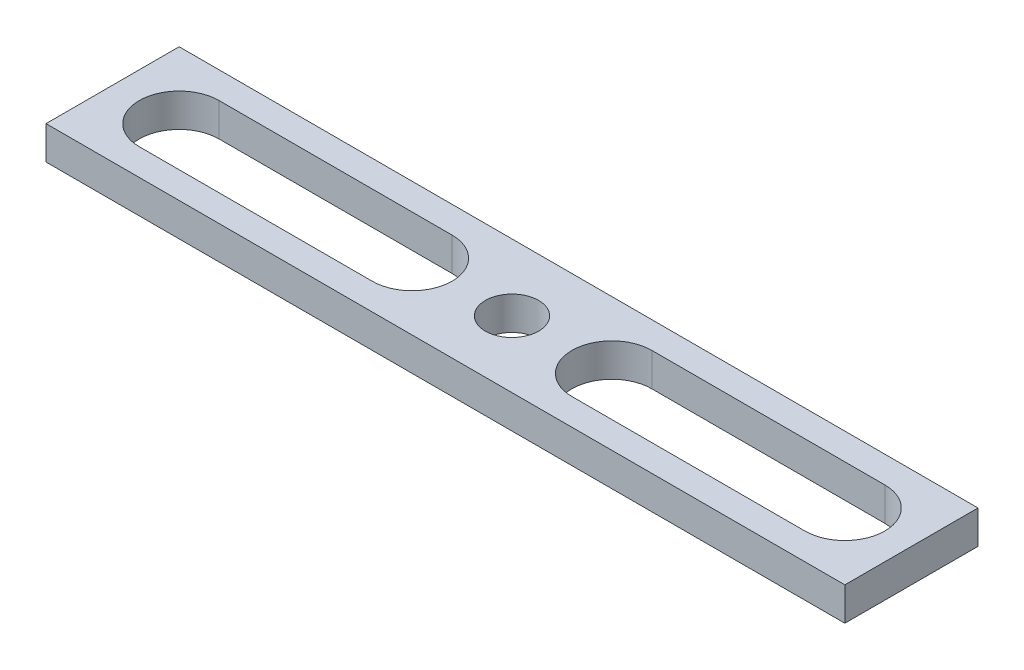
ISO-10303-21;
HEADER;
FILE_DESCRIPTION(('STEP AP214'),'2;1');
FILE_NAME('part.step','',(''),(''),'','','');
FILE_SCHEMA(('AUTOMOTIVE_DESIGN { 1 0 10303 214 1 1 1 1 }'));
ENDSEC;
DATA;
#1=APPLICATION_CONTEXT('core data for automotive mechanical design processes');
#2=APPLICATION_PROTOCOL_DEFINITION('international standard','automotive_design',2000,#1);
#3=PRODUCT_CONTEXT('',#1,'mechanical');
#4=PRODUCT('Part','Part','',(#3));
#5=PRODUCT_RELATED_PRODUCT_CATEGORY('part','',(#4));
#6=PRODUCT_DEFINITION_FORMATION('','',#4);
#7=PRODUCT_DEFINITION_CONTEXT('part definition',#1,'design');
#8=PRODUCT_DEFINITION('design','',#6,#7);
#9=PRODUCT_DEFINITION_SHAPE('','',#8);
#10=(LENGTH_UNIT() NAMED_UNIT(*) SI_UNIT(.MILLI.,.METRE.));
#11=(NAMED_UNIT(*) PLANE_ANGLE_UNIT() SI_UNIT($,.RADIAN.));
#12=(NAMED_UNIT(*) SI_UNIT($,.STERADIAN.) SOLID_ANGLE_UNIT());
#13=UNCERTAINTY_MEASURE_WITH_UNIT(LENGTH_MEASURE(1.E-05),#10,'distance_accuracy_value','');
#14=(GEOMETRIC_REPRESENTATION_CONTEXT(3) GLOBAL_UNCERTAINTY_ASSIGNED_CONTEXT((#13)) GLOBAL_UNIT_ASSIGNED_CONTEXT((#10,
#11,#12)) REPRESENTATION_CONTEXT('',''));
#15=CARTESIAN_POINT('',(0.,0.,0.));
#16=DIRECTION('',(0.,0.,1.));
#17=DIRECTION('',(1.,0.,0.));
#18=AXIS2_PLACEMENT_3D('',#15,#16,#17);
#19=CARTESIAN_POINT('',(-38.1,3.175,-6.35));
#20=DIRECTION('',(1.,0.,0.));
#21=DIRECTION('',(0.,0.,-1.));
#22=AXIS2_PLACEMENT_3D('',#19,#20,#21);
#23=PLANE('',#22);
#24=DIRECTION('',(0.,0.,1.));
#25=VECTOR('',#24,1.);
#26=CARTESIAN_POINT('',(-38.1,0.,-6.35));
#27=LINE('',#26,#25);
#28=CARTESIAN_POINT('',(-38.1,0.,-6.35));
#29=VERTEX_POINT('',#28);
#30=CARTESIAN_POINT('',(-38.1,0.,6.35));
#31=VERTEX_POINT('',#30);
#32=EDGE_CURVE('E195',#29,#31,#27,.T.);
#33=ORIENTED_EDGE('',*,*,#32,.T.);
#34=DIRECTION('',(0.,-1.,0.));
#35=VECTOR('',#34,1.);
#36=CARTESIAN_POINT('',(-38.1,3.175,6.35));
#37=LINE('',#36,#35);
#38=CARTESIAN_POINT('',(-38.1,3.175,6.35));
#39=VERTEX_POINT('',#38);
#40=EDGE_CURVE('E11',#39,#31,#37,.T.);
#41=ORIENTED_EDGE('',*,*,#40,.F.);
#42=DIRECTION('',(0.,0.,1.));
#43=VECTOR('',#42,1.);
#44=CARTESIAN_POINT('',(-38.1,3.175,-6.35));
#45=LINE('',#44,#43);
#46=CARTESIAN_POINT('',(-38.1,3.175,-6.35));
#47=VERTEX_POINT('',#46);
#48=EDGE_CURVE('E198',#47,#39,#45,.T.);
#49=ORIENTED_EDGE('',*,*,#48,.F.);
#50=DIRECTION('',(0.,-1.,0.));
#51=VECTOR('',#50,1.);
#52=CARTESIAN_POINT('',(-38.1,3.175,-6.35));
#53=LINE('',#52,#51);
#54=EDGE_CURVE('E208',#47,#29,#53,.T.);
#55=ORIENTED_EDGE('',*,*,#54,.T.);
#56=EDGE_LOOP('',(#33,#41,#49,#55));
#57=FACE_BOUND('',#56,.T.);
#58=ADVANCED_FACE('F35',(#57),#23,.F.);
#59=CARTESIAN_POINT('',(-38.1,3.175,6.35));
#60=DIRECTION('',(0.,0.,-1.));
#61=DIRECTION('',(-1.,0.,0.));
#62=AXIS2_PLACEMENT_3D('',#59,#60,#61);
#63=PLANE('',#62);
#64=DIRECTION('',(1.,0.,0.));
#65=VECTOR('',#64,1.);
#66=CARTESIAN_POINT('',(-38.1,0.,6.35));
#67=LINE('',#66,#65);
#68=CARTESIAN_POINT('',(38.1,0.,6.35));
#69=VERTEX_POINT('',#68);
#70=EDGE_CURVE('E211',#31,#69,#67,.T.);
#71=ORIENTED_EDGE('',*,*,#70,.T.);
#72=DIRECTION('',(0.,-1.,0.));
#73=VECTOR('',#72,1.);
#74=CARTESIAN_POINT('',(38.1,3.175,6.35));
#75=LINE('',#74,#73);
#76=CARTESIAN_POINT('',(38.1,3.175,6.35));
#77=VERTEX_POINT('',#76);
#78=EDGE_CURVE('E42',#77,#69,#75,.T.);
#79=ORIENTED_EDGE('',*,*,#78,.F.);
#80=DIRECTION('',(1.,0.,0.));
#81=VECTOR('',#80,1.);
#82=CARTESIAN_POINT('',(-38.1,3.175,6.35));
#83=LINE('',#82,#81);
#84=EDGE_CURVE('E201',#39,#77,#83,.T.);
#85=ORIENTED_EDGE('',*,*,#84,.F.);
#86=ORIENTED_EDGE('',*,*,#40,.T.);
#87=EDGE_LOOP('',(#71,#79,#85,#86));
#88=FACE_BOUND('',#87,.T.);
#89=ADVANCED_FACE('F240',(#88),#63,.F.);
#90=CARTESIAN_POINT('',(38.1,3.175,-6.35));
#91=DIRECTION('',(-1.,0.,0.));
#92=DIRECTION('',(0.,0.,1.));
#93=AXIS2_PLACEMENT_3D('',#90,#91,#92);
#94=PLANE('',#93);
#95=DIRECTION('',(0.,0.,-1.));
#96=VECTOR('',#95,1.);
#97=CARTESIAN_POINT('',(38.1,0.,-6.35));
#98=LINE('',#97,#96);
#99=CARTESIAN_POINT('',(38.1,0.,-6.35));
#100=VERTEX_POINT('',#99);
#101=EDGE_CURVE('E213',#69,#100,#98,.T.);
#102=ORIENTED_EDGE('',*,*,#101,.T.);
#103=DIRECTION('',(0.,-1.,0.));
#104=VECTOR('',#103,1.);
#105=CARTESIAN_POINT('',(38.1,3.175,-6.35));
#106=LINE('',#105,#104);
#107=CARTESIAN_POINT('',(38.1,3.175,-6.35));
#108=VERTEX_POINT('',#107);
#109=EDGE_CURVE('E218',#108,#100,#106,.T.);
#110=ORIENTED_EDGE('',*,*,#109,.F.);
#111=DIRECTION('',(0.,0.,-1.));
#112=VECTOR('',#111,1.);
#113=CARTESIAN_POINT('',(38.1,3.175,-6.35));
#114=LINE('',#113,#112);
#115=EDGE_CURVE('E204',#77,#108,#114,.T.);
#116=ORIENTED_EDGE('',*,*,#115,.F.);
#117=ORIENTED_EDGE('',*,*,#78,.T.);
#118=EDGE_LOOP('',(#102,#110,#116,#117));
#119=FACE_BOUND('',#118,.T.);
#120=ADVANCED_FACE('F225',(#119),#94,.F.);
#121=CARTESIAN_POINT('',(-38.1,3.175,-6.35));
#122=DIRECTION('',(0.,0.,1.));
#123=DIRECTION('',(1.,0.,0.));
#124=AXIS2_PLACEMENT_3D('',#121,#122,#123);
#125=PLANE('',#124);
#126=DIRECTION('',(-1.,0.,0.));
#127=VECTOR('',#126,1.);
#128=CARTESIAN_POINT('',(-38.1,0.,-6.35));
#129=LINE('',#128,#127);
#130=EDGE_CURVE('E202',#100,#29,#129,.T.);
#131=ORIENTED_EDGE('',*,*,#130,.T.);
#132=ORIENTED_EDGE('',*,*,#54,.F.);
#133=DIRECTION('',(-1.,0.,0.));
#134=VECTOR('',#133,1.);
#135=CARTESIAN_POINT('',(-38.1,3.175,-6.35));
#136=LINE('',#135,#134);
#137=EDGE_CURVE('E206',#108,#47,#136,.T.);
#138=ORIENTED_EDGE('',*,*,#137,.F.);
#139=ORIENTED_EDGE('',*,*,#109,.T.);
#140=EDGE_LOOP('',(#131,#132,#138,#139));
#141=FACE_BOUND('',#140,.T.);
#142=ADVANCED_FACE('F233',(#141),#125,.F.);
#143=CARTESIAN_POINT('',(0.,3.175,0.));
#144=DIRECTION('',(0.,1.,0.));
#145=DIRECTION('',(0.,0.,1.));
#146=AXIS2_PLACEMENT_3D('',#143,#144,#145);
#147=PLANE('',#146);
#148=CARTESIAN_POINT('',(9.52500000000001,3.175,0.));
#149=DIRECTION('',(0.,1.,0.));
#150=DIRECTION('',(0.,0.,1.));
#151=AXIS2_PLACEMENT_3D('',#148,#149,#150);
#152=CIRCLE('',#151,3.81);
#153=CARTESIAN_POINT('',(9.52500000000001,3.175,-3.81));
#154=VERTEX_POINT('',#153);
#155=CARTESIAN_POINT('',(9.52500000000001,3.175,3.81));
#156=VERTEX_POINT('',#155);
#157=EDGE_CURVE('E49',#154,#156,#152,.T.);
#158=ORIENTED_EDGE('',*,*,#157,.F.);
#159=DIRECTION('',(-1.,0.,0.));
#160=VECTOR('',#159,1.);
#161=CARTESIAN_POINT('',(9.52500000000001,3.175,-3.81));
#162=LINE('',#161,#160);
#163=CARTESIAN_POINT('',(31.75,3.175,-3.81));
#164=VERTEX_POINT('',#163);
#165=EDGE_CURVE('E141',#164,#154,#162,.T.);
#166=ORIENTED_EDGE('',*,*,#165,.F.);
#167=CARTESIAN_POINT('',(31.75,3.175,0.));
#168=DIRECTION('',(0.,1.,0.));
#169=DIRECTION('',(0.,0.,1.));
#170=AXIS2_PLACEMENT_3D('',#167,#168,#169);
#171=CIRCLE('',#170,3.81);
#172=CARTESIAN_POINT('',(31.75,3.175,3.81));
#173=VERTEX_POINT('',#172);
#174=EDGE_CURVE('E144',#173,#164,#171,.T.);
#175=ORIENTED_EDGE('',*,*,#174,.F.);
#176=DIRECTION('',(1.,0.,0.));
#177=VECTOR('',#176,1.);
#178=CARTESIAN_POINT('',(9.52500000000001,3.175,3.81));
#179=LINE('',#178,#177);
#180=EDGE_CURVE('E150',#156,#173,#179,.T.);
#181=ORIENTED_EDGE('',*,*,#180,.F.);
#182=EDGE_LOOP('',(#158,#166,#175,#181));
#183=FACE_BOUND('',#182,.T.);
#184=CARTESIAN_POINT('',(-31.75,3.175,0.));
#185=DIRECTION('',(0.,1.,0.));
#186=DIRECTION('',(0.,0.,1.));
#187=AXIS2_PLACEMENT_3D('',#184,#185,#186);
#188=CIRCLE('',#187,3.81);
#189=CARTESIAN_POINT('',(-31.75,3.175,-3.81));
#190=VERTEX_POINT('',#189);
#191=CARTESIAN_POINT('',(-31.75,3.175,3.81));
#192=VERTEX_POINT('',#191);
#193=EDGE_CURVE('E156',#190,#192,#188,.T.);
#194=ORIENTED_EDGE('',*,*,#193,.F.);
#195=DIRECTION('',(-1.,0.,0.));
#196=VECTOR('',#195,1.);
#197=CARTESIAN_POINT('',(-31.75,3.175,-3.81));
#198=LINE('',#197,#196);
#199=CARTESIAN_POINT('',(-9.525,3.175,-3.81));
#200=VERTEX_POINT('',#199);
#201=EDGE_CURVE('E164',#200,#190,#198,.T.);
#202=ORIENTED_EDGE('',*,*,#201,.F.);
#203=CARTESIAN_POINT('',(-9.525,3.175,0.));
#204=DIRECTION('',(0.,1.,0.));
#205=DIRECTION('',(0.,0.,1.));
#206=AXIS2_PLACEMENT_3D('',#203,#204,#205);
#207=CIRCLE('',#206,3.81);
#208=CARTESIAN_POINT('',(-9.525,3.175,3.81));
#209=VERTEX_POINT('',#208);
#210=EDGE_CURVE('E178',#209,#200,#207,.T.);
#211=ORIENTED_EDGE('',*,*,#210,.F.);
#212=DIRECTION('',(1.,0.,0.));
#213=VECTOR('',#212,1.);
#214=CARTESIAN_POINT('',(-31.75,3.175,3.81));
#215=LINE('',#214,#213);
#216=EDGE_CURVE('E175',#192,#209,#215,.T.);
#217=ORIENTED_EDGE('',*,*,#216,.F.);
#218=EDGE_LOOP('',(#194,#202,#211,#217));
#219=FACE_BOUND('',#218,.T.);
#220=CARTESIAN_POINT('',(0.,3.175,0.));
#221=DIRECTION('',(0.,1.,0.));
#222=DIRECTION('',(0.,0.,1.));
#223=AXIS2_PLACEMENT_3D('',#220,#221,#222);
#224=CIRCLE('',#223,2.54);
#225=CARTESIAN_POINT('',(0.,3.175,2.54));
#226=VERTEX_POINT('',#225);
#227=EDGE_CURVE('E185',#226,#226,#224,.T.);
#228=ORIENTED_EDGE('',*,*,#227,.F.);
#229=EDGE_LOOP('',(#228));
#230=FACE_BOUND('',#229,.T.);
#231=ORIENTED_EDGE('',*,*,#48,.T.);
#232=ORIENTED_EDGE('',*,*,#84,.T.);
#233=ORIENTED_EDGE('',*,*,#115,.T.);
#234=ORIENTED_EDGE('',*,*,#137,.T.);
#235=EDGE_LOOP('',(#231,#232,#233,#234));
#236=FACE_BOUND('',#235,.T.);
#237=ADVANCED_FACE('F239',(#183,#219,#230,#236),#147,.T.);
#238=CARTESIAN_POINT('',(0.,0.,0.));
#239=DIRECTION('',(0.,1.,0.));
#240=DIRECTION('',(0.,0.,1.));
#241=AXIS2_PLACEMENT_3D('',#238,#239,#240);
#242=PLANE('',#241);
#243=DIRECTION('',(-1.,0.,0.));
#244=VECTOR('',#243,1.);
#245=CARTESIAN_POINT('',(9.52500000000001,0.,-3.81));
#246=LINE('',#245,#244);
#247=CARTESIAN_POINT('',(31.75,0.,-3.81));
#248=VERTEX_POINT('',#247);
#249=CARTESIAN_POINT('',(9.52500000000001,0.,-3.81));
#250=VERTEX_POINT('',#249);
#251=EDGE_CURVE('E131',#248,#250,#246,.T.);
#252=ORIENTED_EDGE('',*,*,#251,.T.);
#253=CARTESIAN_POINT('',(9.52500000000001,0.,0.));
#254=DIRECTION('',(0.,1.,0.));
#255=DIRECTION('',(0.,0.,1.));
#256=AXIS2_PLACEMENT_3D('',#253,#254,#255);
#257=CIRCLE('',#256,3.81);
#258=CARTESIAN_POINT('',(9.52500000000001,0.,3.81));
#259=VERTEX_POINT('',#258);
#260=EDGE_CURVE('E125',#250,#259,#257,.T.);
#261=ORIENTED_EDGE('',*,*,#260,.T.);
#262=DIRECTION('',(1.,0.,0.));
#263=VECTOR('',#262,1.);
#264=CARTESIAN_POINT('',(9.52500000000001,0.,3.81));
#265=LINE('',#264,#263);
#266=CARTESIAN_POINT('',(31.75,0.,3.81));
#267=VERTEX_POINT('',#266);
#268=EDGE_CURVE('E134',#259,#267,#265,.T.);
#269=ORIENTED_EDGE('',*,*,#268,.T.);
#270=CARTESIAN_POINT('',(31.75,0.,0.));
#271=DIRECTION('',(0.,1.,0.));
#272=DIRECTION('',(0.,0.,1.));
#273=AXIS2_PLACEMENT_3D('',#270,#271,#272);
#274=CIRCLE('',#273,3.81);
#275=EDGE_CURVE('E57',#267,#248,#274,.T.);
#276=ORIENTED_EDGE('',*,*,#275,.T.);
#277=EDGE_LOOP('',(#252,#261,#269,#276));
#278=FACE_BOUND('',#277,.T.);
#279=DIRECTION('',(-1.,0.,0.));
#280=VECTOR('',#279,1.);
#281=CARTESIAN_POINT('',(-31.75,0.,-3.81));
#282=LINE('',#281,#280);
#283=CARTESIAN_POINT('',(-9.525,0.,-3.81));
#284=VERTEX_POINT('',#283);
#285=CARTESIAN_POINT('',(-31.75,0.,-3.81));
#286=VERTEX_POINT('',#285);
#287=EDGE_CURVE('E170',#284,#286,#282,.T.);
#288=ORIENTED_EDGE('',*,*,#287,.T.);
#289=CARTESIAN_POINT('',(-31.75,0.,0.));
#290=DIRECTION('',(0.,1.,0.));
#291=DIRECTION('',(0.,0.,1.));
#292=AXIS2_PLACEMENT_3D('',#289,#290,#291);
#293=CIRCLE('',#292,3.81);
#294=CARTESIAN_POINT('',(-31.75,0.,3.81));
#295=VERTEX_POINT('',#294);
#296=EDGE_CURVE('E160',#286,#295,#293,.T.);
#297=ORIENTED_EDGE('',*,*,#296,.T.);
#298=DIRECTION('',(1.,0.,0.));
#299=VECTOR('',#298,1.);
#300=CARTESIAN_POINT('',(-31.75,0.,3.81));
#301=LINE('',#300,#299);
#302=CARTESIAN_POINT('',(-9.525,0.,3.81));
#303=VERTEX_POINT('',#302);
#304=EDGE_CURVE('E163',#295,#303,#301,.T.);
#305=ORIENTED_EDGE('',*,*,#304,.T.);
#306=CARTESIAN_POINT('',(-9.525,0.,0.));
#307=DIRECTION('',(0.,1.,0.));
#308=DIRECTION('',(0.,0.,1.));
#309=AXIS2_PLACEMENT_3D('',#306,#307,#308);
#310=CIRCLE('',#309,3.81);
#311=EDGE_CURVE('E167',#303,#284,#310,.T.);
#312=ORIENTED_EDGE('',*,*,#311,.T.);
#313=EDGE_LOOP('',(#288,#297,#305,#312));
#314=FACE_BOUND('',#313,.T.);
#315=CARTESIAN_POINT('',(0.,0.,0.));
#316=DIRECTION('',(0.,1.,0.));
#317=DIRECTION('',(0.,0.,1.));
#318=AXIS2_PLACEMENT_3D('',#315,#316,#317);
#319=CIRCLE('',#318,2.54);
#320=CARTESIAN_POINT('',(0.,0.,2.54));
#321=VERTEX_POINT('',#320);
#322=EDGE_CURVE('E192',#321,#321,#319,.T.);
#323=ORIENTED_EDGE('',*,*,#322,.T.);
#324=EDGE_LOOP('',(#323));
#325=FACE_BOUND('',#324,.T.);
#326=ORIENTED_EDGE('',*,*,#32,.F.);
#327=ORIENTED_EDGE('',*,*,#130,.F.);
#328=ORIENTED_EDGE('',*,*,#101,.F.);
#329=ORIENTED_EDGE('',*,*,#70,.F.);
#330=EDGE_LOOP('',(#326,#327,#328,#329));
#331=FACE_BOUND('',#330,.T.);
#332=ADVANCED_FACE('F138',(#278,#314,#325,#331),#242,.F.);
#333=CARTESIAN_POINT('',(0.,0.,0.));
#334=DIRECTION('',(0.,1.,0.));
#335=DIRECTION('',(0.,0.,1.));
#336=AXIS2_PLACEMENT_3D('',#333,#334,#335);
#337=CYLINDRICAL_SURFACE('',#336,2.54);
#338=ORIENTED_EDGE('',*,*,#322,.F.);
#339=EDGE_LOOP('',(#338));
#340=FACE_BOUND('',#339,.T.);
#341=ORIENTED_EDGE('',*,*,#227,.T.);
#342=EDGE_LOOP('',(#341));
#343=FACE_BOUND('',#342,.T.);
#344=ADVANCED_FACE('F252',(#340,#343),#337,.F.);
#345=CARTESIAN_POINT('',(-31.75,0.,0.));
#346=DIRECTION('',(0.,1.,0.));
#347=DIRECTION('',(0.,0.,1.));
#348=AXIS2_PLACEMENT_3D('',#345,#346,#347);
#349=CYLINDRICAL_SURFACE('',#348,3.81);
#350=ORIENTED_EDGE('',*,*,#193,.T.);
#351=DIRECTION('',(0.,1.,0.));
#352=VECTOR('',#351,1.);
#353=CARTESIAN_POINT('',(-31.75,0.,3.81));
#354=LINE('',#353,#352);
#355=EDGE_CURVE('E173',#295,#192,#354,.T.);
#356=ORIENTED_EDGE('',*,*,#355,.F.);
#357=ORIENTED_EDGE('',*,*,#296,.F.);
#358=DIRECTION('',(0.,1.,0.));
#359=VECTOR('',#358,1.);
#360=CARTESIAN_POINT('',(-31.75,0.,-3.81));
#361=LINE('',#360,#359);
#362=EDGE_CURVE('E183',#286,#190,#361,.T.);
#363=ORIENTED_EDGE('',*,*,#362,.T.);
#364=EDGE_LOOP('',(#350,#356,#357,#363));
#365=FACE_BOUND('',#364,.T.);
#366=ADVANCED_FACE('F258',(#365),#349,.F.);
#367=CARTESIAN_POINT('',(-31.75,0.,-3.81));
#368=DIRECTION('',(0.,0.,-1.));
#369=DIRECTION('',(-1.,0.,0.));
#370=AXIS2_PLACEMENT_3D('',#367,#368,#369);
#371=PLANE('',#370);
#372=ORIENTED_EDGE('',*,*,#201,.T.);
#373=ORIENTED_EDGE('',*,*,#362,.F.);
#374=ORIENTED_EDGE('',*,*,#287,.F.);
#375=DIRECTION('',(0.,1.,0.));
#376=VECTOR('',#375,1.);
#377=CARTESIAN_POINT('',(-9.525,0.,-3.81));
#378=LINE('',#377,#376);
#379=EDGE_CURVE('E186',#284,#200,#378,.T.);
#380=ORIENTED_EDGE('',*,*,#379,.T.);
#381=EDGE_LOOP('',(#372,#373,#374,#380));
#382=FACE_BOUND('',#381,.T.);
#383=ADVANCED_FACE('F262',(#382),#371,.F.);
#384=CARTESIAN_POINT('',(-9.525,0.,0.));
#385=DIRECTION('',(0.,1.,0.));
#386=DIRECTION('',(0.,0.,1.));
#387=AXIS2_PLACEMENT_3D('',#384,#385,#386);
#388=CYLINDRICAL_SURFACE('',#387,3.81);
#389=ORIENTED_EDGE('',*,*,#210,.T.);
#390=ORIENTED_EDGE('',*,*,#379,.F.);
#391=ORIENTED_EDGE('',*,*,#311,.F.);
#392=DIRECTION('',(0.,1.,0.));
#393=VECTOR('',#392,1.);
#394=CARTESIAN_POINT('',(-9.525,0.,3.81));
#395=LINE('',#394,#393);
#396=EDGE_CURVE('E188',#303,#209,#395,.T.);
#397=ORIENTED_EDGE('',*,*,#396,.T.);
#398=EDGE_LOOP('',(#389,#390,#391,#397));
#399=FACE_BOUND('',#398,.T.);
#400=ADVANCED_FACE('F267',(#399),#388,.F.);
#401=CARTESIAN_POINT('',(-31.75,0.,3.81));
#402=DIRECTION('',(0.,0.,1.));
#403=DIRECTION('',(1.,0.,0.));
#404=AXIS2_PLACEMENT_3D('',#401,#402,#403);
#405=PLANE('',#404);
#406=ORIENTED_EDGE('',*,*,#216,.T.);
#407=ORIENTED_EDGE('',*,*,#396,.F.);
#408=ORIENTED_EDGE('',*,*,#304,.F.);
#409=ORIENTED_EDGE('',*,*,#355,.T.);
#410=EDGE_LOOP('',(#406,#407,#408,#409));
#411=FACE_BOUND('',#410,.T.);
#412=ADVANCED_FACE('F264',(#411),#405,.F.);
#413=CARTESIAN_POINT('',(9.52500000000001,0.,0.));
#414=DIRECTION('',(0.,1.,0.));
#415=DIRECTION('',(0.,0.,1.));
#416=AXIS2_PLACEMENT_3D('',#413,#414,#415);
#417=CYLINDRICAL_SURFACE('',#416,3.81);
#418=ORIENTED_EDGE('',*,*,#157,.T.);
#419=DIRECTION('',(0.,1.,0.));
#420=VECTOR('',#419,1.);
#421=CARTESIAN_POINT('',(9.52500000000001,0.,3.81));
#422=LINE('',#421,#420);
#423=EDGE_CURVE('E121',#259,#156,#422,.T.);
#424=ORIENTED_EDGE('',*,*,#423,.F.);
#425=ORIENTED_EDGE('',*,*,#260,.F.);
#426=DIRECTION('',(0.,1.,0.));
#427=VECTOR('',#426,1.);
#428=CARTESIAN_POINT('',(9.52500000000001,0.,-3.81));
#429=LINE('',#428,#427);
#430=EDGE_CURVE('E154',#250,#154,#429,.T.);
#431=ORIENTED_EDGE('',*,*,#430,.T.);
#432=EDGE_LOOP('',(#418,#424,#425,#431));
#433=FACE_BOUND('',#432,.T.);
#434=ADVANCED_FACE('F123',(#433),#417,.F.);
#435=CARTESIAN_POINT('',(9.52500000000001,0.,-3.81));
#436=DIRECTION('',(0.,0.,-1.));
#437=DIRECTION('',(-1.,0.,0.));
#438=AXIS2_PLACEMENT_3D('',#435,#436,#437);
#439=PLANE('',#438);
#440=ORIENTED_EDGE('',*,*,#165,.T.);
#441=ORIENTED_EDGE('',*,*,#430,.F.);
#442=ORIENTED_EDGE('',*,*,#251,.F.);
#443=DIRECTION('',(0.,1.,0.));
#444=VECTOR('',#443,1.);
#445=CARTESIAN_POINT('',(31.75,0.,-3.81));
#446=LINE('',#445,#444);
#447=EDGE_CURVE('E157',#248,#164,#446,.T.);
#448=ORIENTED_EDGE('',*,*,#447,.T.);
#449=EDGE_LOOP('',(#440,#441,#442,#448));
#450=FACE_BOUND('',#449,.T.);
#451=ADVANCED_FACE('F277',(#450),#439,.F.);
#452=CARTESIAN_POINT('',(31.75,0.,0.));
#453=DIRECTION('',(0.,1.,0.));
#454=DIRECTION('',(0.,0.,1.));
#455=AXIS2_PLACEMENT_3D('',#452,#453,#454);
#456=CYLINDRICAL_SURFACE('',#455,3.81);
#457=ORIENTED_EDGE('',*,*,#174,.T.);
#458=ORIENTED_EDGE('',*,*,#447,.F.);
#459=ORIENTED_EDGE('',*,*,#275,.F.);
#460=DIRECTION('',(0.,1.,0.));
#461=VECTOR('',#460,1.);
#462=CARTESIAN_POINT('',(31.75,0.,3.81));
#463=LINE('',#462,#461);
#464=EDGE_CURVE('E130',#267,#173,#463,.T.);
#465=ORIENTED_EDGE('',*,*,#464,.T.);
#466=EDGE_LOOP('',(#457,#458,#459,#465));
#467=FACE_BOUND('',#466,.T.);
#468=ADVANCED_FACE('F280',(#467),#456,.F.);
#469=CARTESIAN_POINT('',(9.52500000000001,0.,3.81));
#470=DIRECTION('',(0.,0.,1.));
#471=DIRECTION('',(1.,0.,0.));
#472=AXIS2_PLACEMENT_3D('',#469,#470,#471);
#473=PLANE('',#472);
#474=ORIENTED_EDGE('',*,*,#180,.T.);
#475=ORIENTED_EDGE('',*,*,#464,.F.);
#476=ORIENTED_EDGE('',*,*,#268,.F.);
#477=ORIENTED_EDGE('',*,*,#423,.T.);
#478=EDGE_LOOP('',(#474,#475,#476,#477));
#479=FACE_BOUND('',#478,.T.);
#480=ADVANCED_FACE('F135',(#479),#473,.F.);
#481=CLOSED_SHELL('',(#58,#89,#120,#142,#237,#332,#344,#366,#383,#400,#412,#434,#451,#468,#480));
#482=MANIFOLD_SOLID_BREP('B2',#481);
#483=ADVANCED_BREP_SHAPE_REPRESENTATION('',(#18,#482),#14);
#484=SHAPE_DEFINITION_REPRESENTATION(#9,#483);
ENDSEC;
END-ISO-10303-21;
